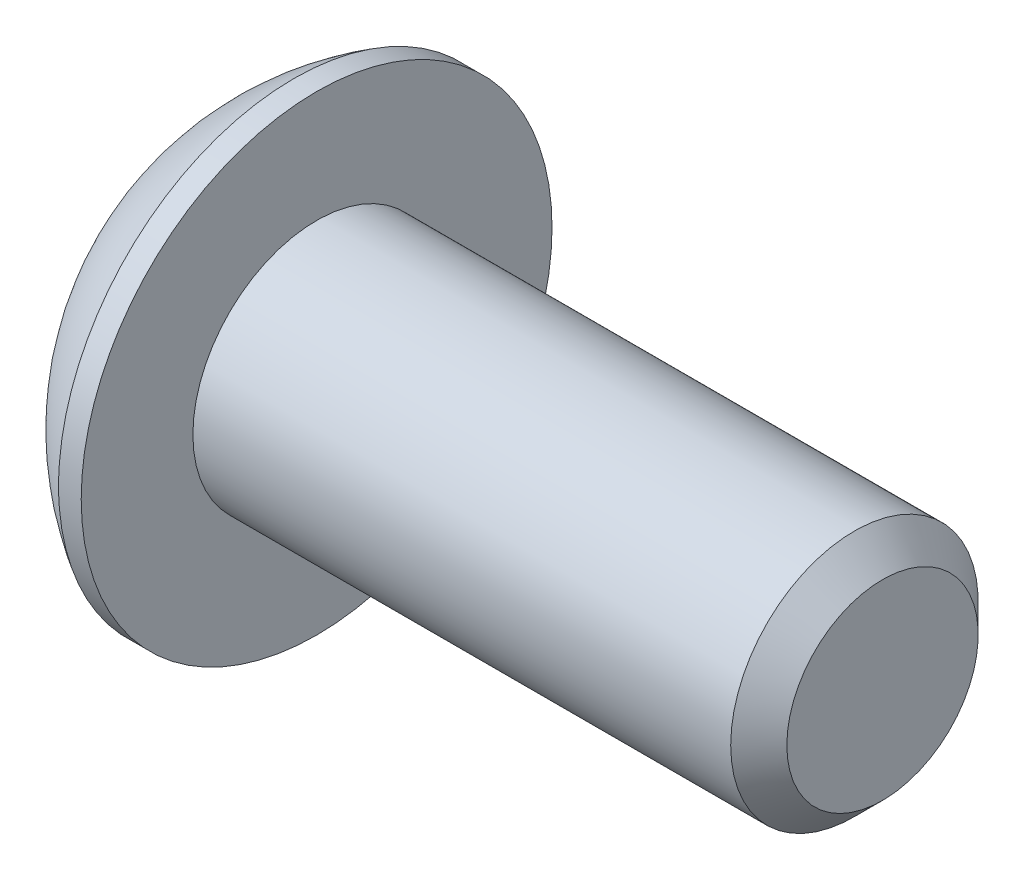
ISO-10303-21;
HEADER;
FILE_DESCRIPTION(('STEP AP214'),'2;1');
FILE_NAME('part.step','',(''),(''),'','','');
FILE_SCHEMA(('AUTOMOTIVE_DESIGN { 1 0 10303 214 1 1 1 1 }'));
ENDSEC;
DATA;
#1=APPLICATION_CONTEXT('core data for automotive mechanical design processes');
#2=APPLICATION_PROTOCOL_DEFINITION('international standard','automotive_design',2000,#1);
#3=PRODUCT_CONTEXT('',#1,'mechanical');
#4=PRODUCT('Part','Part','',(#3));
#5=PRODUCT_RELATED_PRODUCT_CATEGORY('part','',(#4));
#6=PRODUCT_DEFINITION_FORMATION('','',#4);
#7=PRODUCT_DEFINITION_CONTEXT('part definition',#1,'design');
#8=PRODUCT_DEFINITION('design','',#6,#7);
#9=PRODUCT_DEFINITION_SHAPE('','',#8);
#10=(LENGTH_UNIT() NAMED_UNIT(*) SI_UNIT(.MILLI.,.METRE.));
#11=(NAMED_UNIT(*) PLANE_ANGLE_UNIT() SI_UNIT($,.RADIAN.));
#12=(NAMED_UNIT(*) SI_UNIT($,.STERADIAN.) SOLID_ANGLE_UNIT());
#13=UNCERTAINTY_MEASURE_WITH_UNIT(LENGTH_MEASURE(1.E-05),#10,'distance_accuracy_value','');
#14=(GEOMETRIC_REPRESENTATION_CONTEXT(3) GLOBAL_UNCERTAINTY_ASSIGNED_CONTEXT((#13)) GLOBAL_UNIT_ASSIGNED_CONTEXT((#10,
#11,#12)) REPRESENTATION_CONTEXT('',''));
#15=CARTESIAN_POINT('',(0.,0.,0.));
#16=DIRECTION('',(0.,0.,1.));
#17=DIRECTION('',(1.,0.,0.));
#18=AXIS2_PLACEMENT_3D('',#15,#16,#17);
#19=CARTESIAN_POINT('',(1.32080000003043,0.,0.));
#20=DIRECTION('',(-1.,0.,0.));
#21=DIRECTION('',(0.,0.,1.));
#22=AXIS2_PLACEMENT_3D('',#19,#20,#21);
#23=CONICAL_SURFACE('',#22,1.19379999983948,1.04719755103066);
#24=CARTESIAN_POINT('',(2.01004075134392,0.,-1.70530256582424E-10));
#25=VERTEX_POINT('',#24);
#26=VERTEX_LOOP('',#25);
#27=FACE_BOUND('',#26,.T.);
#28=CARTESIAN_POINT('',(1.32079999996479,0.,0.));
#29=DIRECTION('',(-1.,0.,0.));
#30=DIRECTION('',(0.,0.,1.));
#31=AXIS2_PLACEMENT_3D('',#28,#29,#30);
#32=CIRCLE('',#31,1.19379999995317);
#33=CARTESIAN_POINT('',(1.3207999999758,1.03386112701759,-0.596899999988293));
#34=VERTEX_POINT('',#33);
#35=CARTESIAN_POINT('',(1.32079999995829,1.4946573850379E-12,-1.1937999999933));
#36=VERTEX_POINT('',#35);
#37=EDGE_CURVE('E87',#34,#36,#32,.T.);
#38=ORIENTED_EDGE('',*,*,#37,.T.);
#39=CARTESIAN_POINT('',(1.32079999996479,0.,0.));
#40=DIRECTION('',(-1.,0.,0.));
#41=DIRECTION('',(0.,0.,1.));
#42=AXIS2_PLACEMENT_3D('',#39,#40,#41);
#43=CIRCLE('',#42,1.19379999995317);
#44=CARTESIAN_POINT('',(1.3207999999758,-1.03386112701758,-0.596899999988292));
#45=VERTEX_POINT('',#44);
#46=EDGE_CURVE('E20',#36,#45,#43,.T.);
#47=ORIENTED_EDGE('',*,*,#46,.T.);
#48=CARTESIAN_POINT('',(1.32079999996479,0.,0.));
#49=DIRECTION('',(-1.,0.,0.));
#50=DIRECTION('',(0.,0.,1.));
#51=AXIS2_PLACEMENT_3D('',#48,#49,#50);
#52=CIRCLE('',#51,1.19379999995317);
#53=CARTESIAN_POINT('',(1.3207999999758,-1.03386112701759,0.596899999988292));
#54=VERTEX_POINT('',#53);
#55=EDGE_CURVE('E92',#45,#54,#52,.T.);
#56=ORIENTED_EDGE('',*,*,#55,.T.);
#57=CARTESIAN_POINT('',(1.32079999996479,0.,0.));
#58=DIRECTION('',(-1.,0.,0.));
#59=DIRECTION('',(0.,0.,1.));
#60=AXIS2_PLACEMENT_3D('',#57,#58,#59);
#61=CIRCLE('',#60,1.19379999995317);
#62=CARTESIAN_POINT('',(1.32079999995829,0.,1.1937999999933));
#63=VERTEX_POINT('',#62);
#64=EDGE_CURVE('E104',#54,#63,#61,.T.);
#65=ORIENTED_EDGE('',*,*,#64,.T.);
#66=CARTESIAN_POINT('',(1.32079999996479,0.,0.));
#67=DIRECTION('',(-1.,0.,0.));
#68=DIRECTION('',(0.,0.,1.));
#69=AXIS2_PLACEMENT_3D('',#66,#67,#68);
#70=CIRCLE('',#69,1.19379999995317);
#71=CARTESIAN_POINT('',(1.3207999999758,1.03386112701759,0.596899999988293));
#72=VERTEX_POINT('',#71);
#73=EDGE_CURVE('E112',#63,#72,#70,.T.);
#74=ORIENTED_EDGE('',*,*,#73,.T.);
#75=CARTESIAN_POINT('',(1.32079999996479,0.,0.));
#76=DIRECTION('',(-1.,0.,0.));
#77=DIRECTION('',(0.,0.,1.));
#78=AXIS2_PLACEMENT_3D('',#75,#76,#77);
#79=CIRCLE('',#78,1.19379999995317);
#80=EDGE_CURVE('E456',#72,#34,#79,.T.);
#81=ORIENTED_EDGE('',*,*,#80,.T.);
#82=EDGE_LOOP('',(#38,#47,#56,#65,#74,#81));
#83=FACE_BOUND('',#82,.T.);
#84=ADVANCED_FACE('F17',(#27,#83),#23,.F.);
#85=CARTESIAN_POINT('',(1.3208,-2.06772225407572,-1.1938));
#86=DIRECTION('',(1.,0.,0.));
#87=DIRECTION('',(0.,0.,-1.));
#88=AXIS2_PLACEMENT_3D('',#85,#86,#87);
#89=PLANE('',#88);
#90=ORIENTED_EDGE('',*,*,#46,.F.);
#91=DIRECTION('',(0.,1.,0.));
#92=VECTOR('',#91,1.);
#93=CARTESIAN_POINT('',(1.32080000000001,0.689240751358577,-1.1938));
#94=LINE('',#93,#92);
#95=CARTESIAN_POINT('',(1.32079999999561,-0.689240751358574,-1.1938));
#96=VERTEX_POINT('',#95);
#97=EDGE_CURVE('E99',#96,#36,#94,.T.);
#98=ORIENTED_EDGE('',*,*,#97,.F.);
#99=DIRECTION('',(0.,-0.5,0.866025403784439));
#100=VECTOR('',#99,1.);
#101=CARTESIAN_POINT('',(1.32079999998682,-0.689240751358574,-1.1938));
#102=LINE('',#101,#100);
#103=EDGE_CURVE('E97',#45,#96,#102,.F.);
#104=ORIENTED_EDGE('',*,*,#103,.F.);
#105=EDGE_LOOP('',(#90,#98,#104));
#106=FACE_BOUND('',#105,.T.);
#107=ADVANCED_FACE('F98',(#106),#89,.F.);
#108=CARTESIAN_POINT('',(1.3208,-2.06772225407572,-1.1938));
#109=DIRECTION('',(1.,0.,0.));
#110=DIRECTION('',(0.,0.,-1.));
#111=AXIS2_PLACEMENT_3D('',#108,#109,#110);
#112=PLANE('',#111);
#113=ORIENTED_EDGE('',*,*,#37,.F.);
#114=DIRECTION('',(0.,-0.5,-0.866025403784439));
#115=VECTOR('',#114,1.);
#116=CARTESIAN_POINT('',(1.32080000000002,1.37848150271715,0.));
#117=LINE('',#116,#115);
#118=CARTESIAN_POINT('',(1.32079999999562,0.689240751358091,-1.19380000000083));
#119=VERTEX_POINT('',#118);
#120=EDGE_CURVE('E142',#119,#34,#117,.F.);
#121=ORIENTED_EDGE('',*,*,#120,.F.);
#122=DIRECTION('',(0.,1.,0.));
#123=VECTOR('',#122,1.);
#124=CARTESIAN_POINT('',(1.32079999998682,0.689240751358577,-1.1938));
#125=LINE('',#124,#123);
#126=EDGE_CURVE('E118',#36,#119,#125,.T.);
#127=ORIENTED_EDGE('',*,*,#126,.F.);
#128=EDGE_LOOP('',(#113,#121,#127));
#129=FACE_BOUND('',#128,.T.);
#130=ADVANCED_FACE('F259',(#129),#112,.F.);
#131=CARTESIAN_POINT('',(1.3208,-2.06772225407572,-1.1938));
#132=DIRECTION('',(1.,0.,0.));
#133=DIRECTION('',(0.,0.,-1.));
#134=AXIS2_PLACEMENT_3D('',#131,#132,#133);
#135=PLANE('',#134);
#136=ORIENTED_EDGE('',*,*,#80,.F.);
#137=DIRECTION('',(0.,0.5,-0.866025403784439));
#138=VECTOR('',#137,1.);
#139=CARTESIAN_POINT('',(1.32080000000001,0.689240751358576,1.1938));
#140=LINE('',#139,#138);
#141=CARTESIAN_POINT('',(1.32079999999561,1.37848150271715,0.));
#142=VERTEX_POINT('',#141);
#143=EDGE_CURVE('E152',#142,#72,#140,.F.);
#144=ORIENTED_EDGE('',*,*,#143,.F.);
#145=DIRECTION('',(0.,-0.5,-0.866025403784439));
#146=VECTOR('',#145,1.);
#147=CARTESIAN_POINT('',(1.32079999998682,1.37848150271715,0.));
#148=LINE('',#147,#146);
#149=EDGE_CURVE('E161',#34,#142,#148,.F.);
#150=ORIENTED_EDGE('',*,*,#149,.F.);
#151=EDGE_LOOP('',(#136,#144,#150));
#152=FACE_BOUND('',#151,.T.);
#153=ADVANCED_FACE('F255',(#152),#135,.F.);
#154=CARTESIAN_POINT('',(1.3208,-2.06772225407572,-1.1938));
#155=DIRECTION('',(1.,0.,0.));
#156=DIRECTION('',(0.,0.,-1.));
#157=AXIS2_PLACEMENT_3D('',#154,#155,#156);
#158=PLANE('',#157);
#159=ORIENTED_EDGE('',*,*,#73,.F.);
#160=DIRECTION('',(0.,1.,0.));
#161=VECTOR('',#160,1.);
#162=CARTESIAN_POINT('',(1.32080000000001,-0.689240751358574,1.1938));
#163=LINE('',#162,#161);
#164=CARTESIAN_POINT('',(1.32079999999561,0.689240751358576,1.1938));
#165=VERTEX_POINT('',#164);
#166=EDGE_CURVE('E128',#165,#63,#163,.F.);
#167=ORIENTED_EDGE('',*,*,#166,.F.);
#168=DIRECTION('',(0.,0.5,-0.866025403784439));
#169=VECTOR('',#168,1.);
#170=CARTESIAN_POINT('',(1.32079999998682,0.689240751358576,1.1938));
#171=LINE('',#170,#169);
#172=EDGE_CURVE('E139',#72,#165,#171,.F.);
#173=ORIENTED_EDGE('',*,*,#172,.F.);
#174=EDGE_LOOP('',(#159,#167,#173));
#175=FACE_BOUND('',#174,.T.);
#176=ADVANCED_FACE('F252',(#175),#158,.F.);
#177=CARTESIAN_POINT('',(1.3208,-2.06772225407572,-1.1938));
#178=DIRECTION('',(1.,0.,0.));
#179=DIRECTION('',(0.,0.,-1.));
#180=AXIS2_PLACEMENT_3D('',#177,#178,#179);
#181=PLANE('',#180);
#182=ORIENTED_EDGE('',*,*,#55,.F.);
#183=DIRECTION('',(0.,-0.5,0.866025403784439));
#184=VECTOR('',#183,1.);
#185=CARTESIAN_POINT('',(1.32080000000001,-0.689240751358574,-1.1938));
#186=LINE('',#185,#184);
#187=CARTESIAN_POINT('',(1.32079999999341,-1.37848150271715,0.));
#188=VERTEX_POINT('',#187);
#189=EDGE_CURVE('E103',#188,#45,#186,.F.);
#190=ORIENTED_EDGE('',*,*,#189,.F.);
#191=DIRECTION('',(0.,0.5,0.866025403784439));
#192=VECTOR('',#191,1.);
#193=CARTESIAN_POINT('',(1.32079999998682,-1.37848150271715,0.));
#194=LINE('',#193,#192);
#195=EDGE_CURVE('E110',#54,#188,#194,.F.);
#196=ORIENTED_EDGE('',*,*,#195,.F.);
#197=EDGE_LOOP('',(#182,#190,#196));
#198=FACE_BOUND('',#197,.T.);
#199=ADVANCED_FACE('F107',(#198),#181,.F.);
#200=CARTESIAN_POINT('',(1.3208,-2.06772225407572,-1.1938));
#201=DIRECTION('',(1.,0.,0.));
#202=DIRECTION('',(0.,0.,-1.));
#203=AXIS2_PLACEMENT_3D('',#200,#201,#202);
#204=PLANE('',#203);
#205=ORIENTED_EDGE('',*,*,#64,.F.);
#206=DIRECTION('',(0.,0.5,0.866025403784439));
#207=VECTOR('',#206,1.);
#208=CARTESIAN_POINT('',(1.32080000000001,-1.37848150271715,0.));
#209=LINE('',#208,#207);
#210=CARTESIAN_POINT('',(1.32079999999561,-0.689240751358092,1.19380000000083));
#211=VERTEX_POINT('',#210);
#212=EDGE_CURVE('E196',#211,#54,#209,.F.);
#213=ORIENTED_EDGE('',*,*,#212,.F.);
#214=DIRECTION('',(0.,1.,0.));
#215=VECTOR('',#214,1.);
#216=CARTESIAN_POINT('',(1.32079999998682,-0.689240751358574,1.1938));
#217=LINE('',#216,#215);
#218=EDGE_CURVE('E136',#63,#211,#217,.F.);
#219=ORIENTED_EDGE('',*,*,#218,.F.);
#220=EDGE_LOOP('',(#205,#213,#219));
#221=FACE_BOUND('',#220,.T.);
#222=ADVANCED_FACE('F246',(#221),#204,.F.);
#223=CARTESIAN_POINT('',(1.3208,-0.689240751358574,-1.1938));
#224=DIRECTION('',(0.,0.866025403784439,0.5));
#225=DIRECTION('',(0.,-0.5,0.866025403784439));
#226=AXIS2_PLACEMENT_3D('',#223,#224,#225);
#227=PLANE('',#226);
#228=DIRECTION('',(1.,0.,0.));
#229=VECTOR('',#228,1.);
#230=CARTESIAN_POINT('',(1.3208,-1.37848150271715,0.));
#231=LINE('',#230,#229);
#232=CARTESIAN_POINT('',(0.,-1.37848150271715,0.));
#233=VERTEX_POINT('',#232);
#234=EDGE_CURVE('E117',#188,#233,#231,.F.);
#235=ORIENTED_EDGE('',*,*,#234,.F.);
#236=ORIENTED_EDGE('',*,*,#189,.T.);
#237=ORIENTED_EDGE('',*,*,#103,.T.);
#238=DIRECTION('',(1.,0.,0.));
#239=VECTOR('',#238,1.);
#240=CARTESIAN_POINT('',(1.3208,-0.689240751358574,-1.1938));
#241=LINE('',#240,#239);
#242=CARTESIAN_POINT('',(0.,-0.689240751358574,-1.1938));
#243=VERTEX_POINT('',#242);
#244=EDGE_CURVE('E120',#243,#96,#241,.T.);
#245=ORIENTED_EDGE('',*,*,#244,.F.);
#246=DIRECTION('',(0.,0.5,-0.866025403784439));
#247=VECTOR('',#246,1.);
#248=CARTESIAN_POINT('',(0.,-1.37848150271715,0.));
#249=LINE('',#248,#247);
#250=EDGE_CURVE('E183',#233,#243,#249,.T.);
#251=ORIENTED_EDGE('',*,*,#250,.F.);
#252=EDGE_LOOP('',(#235,#236,#237,#245,#251));
#253=FACE_BOUND('',#252,.T.);
#254=ADVANCED_FACE('F114',(#253),#227,.T.);
#255=CARTESIAN_POINT('',(1.3208,0.689240751358577,-1.1938));
#256=DIRECTION('',(0.,0.,1.));
#257=DIRECTION('',(1.,0.,0.));
#258=AXIS2_PLACEMENT_3D('',#255,#256,#257);
#259=PLANE('',#258);
#260=ORIENTED_EDGE('',*,*,#244,.T.);
#261=ORIENTED_EDGE('',*,*,#97,.T.);
#262=ORIENTED_EDGE('',*,*,#126,.T.);
#263=DIRECTION('',(1.,0.,0.));
#264=VECTOR('',#263,1.);
#265=CARTESIAN_POINT('',(1.3208,0.689240751358577,-1.1938));
#266=LINE('',#265,#264);
#267=CARTESIAN_POINT('',(0.,0.689240751358576,-1.1938));
#268=VERTEX_POINT('',#267);
#269=EDGE_CURVE('E163',#268,#119,#266,.T.);
#270=ORIENTED_EDGE('',*,*,#269,.F.);
#271=DIRECTION('',(0.,1.,0.));
#272=VECTOR('',#271,1.);
#273=CARTESIAN_POINT('',(0.,0.,-1.1938));
#274=LINE('',#273,#272);
#275=EDGE_CURVE('E168',#243,#268,#274,.T.);
#276=ORIENTED_EDGE('',*,*,#275,.F.);
#277=EDGE_LOOP('',(#260,#261,#262,#270,#276));
#278=FACE_BOUND('',#277,.T.);
#279=ADVANCED_FACE('F239',(#278),#259,.T.);
#280=CARTESIAN_POINT('',(1.3208,1.37848150271715,0.));
#281=DIRECTION('',(0.,-0.866025403784439,0.5));
#282=DIRECTION('',(0.,-0.5,-0.866025403784439));
#283=AXIS2_PLACEMENT_3D('',#280,#281,#282);
#284=PLANE('',#283);
#285=ORIENTED_EDGE('',*,*,#269,.T.);
#286=ORIENTED_EDGE('',*,*,#120,.T.);
#287=ORIENTED_EDGE('',*,*,#149,.T.);
#288=DIRECTION('',(1.,0.,0.));
#289=VECTOR('',#288,1.);
#290=CARTESIAN_POINT('',(1.3208,1.37848150271715,0.));
#291=LINE('',#290,#289);
#292=CARTESIAN_POINT('',(0.,1.37848150271715,0.));
#293=VERTEX_POINT('',#292);
#294=EDGE_CURVE('E141',#293,#142,#291,.T.);
#295=ORIENTED_EDGE('',*,*,#294,.F.);
#296=DIRECTION('',(0.,0.5,0.866025403784439));
#297=VECTOR('',#296,1.);
#298=CARTESIAN_POINT('',(0.,0.689240751358577,-1.1938));
#299=LINE('',#298,#297);
#300=EDGE_CURVE('E149',#268,#293,#299,.T.);
#301=ORIENTED_EDGE('',*,*,#300,.F.);
#302=EDGE_LOOP('',(#285,#286,#287,#295,#301));
#303=FACE_BOUND('',#302,.T.);
#304=ADVANCED_FACE('F235',(#303),#284,.T.);
#305=CARTESIAN_POINT('',(1.3208,0.689240751358576,1.1938));
#306=DIRECTION('',(0.,-0.866025403784439,-0.5));
#307=DIRECTION('',(0.,0.5,-0.866025403784439));
#308=AXIS2_PLACEMENT_3D('',#305,#306,#307);
#309=PLANE('',#308);
#310=ORIENTED_EDGE('',*,*,#294,.T.);
#311=ORIENTED_EDGE('',*,*,#143,.T.);
#312=ORIENTED_EDGE('',*,*,#172,.T.);
#313=DIRECTION('',(1.,0.,0.));
#314=VECTOR('',#313,1.);
#315=CARTESIAN_POINT('',(1.3208,0.689240751358576,1.1938));
#316=LINE('',#315,#314);
#317=CARTESIAN_POINT('',(0.,0.689240751358577,1.1938));
#318=VERTEX_POINT('',#317);
#319=EDGE_CURVE('E131',#318,#165,#316,.T.);
#320=ORIENTED_EDGE('',*,*,#319,.F.);
#321=DIRECTION('',(0.,-0.5,0.866025403784439));
#322=VECTOR('',#321,1.);
#323=CARTESIAN_POINT('',(0.,1.37848150271715,0.));
#324=LINE('',#323,#322);
#325=EDGE_CURVE('E145',#293,#318,#324,.T.);
#326=ORIENTED_EDGE('',*,*,#325,.F.);
#327=EDGE_LOOP('',(#310,#311,#312,#320,#326));
#328=FACE_BOUND('',#327,.T.);
#329=ADVANCED_FACE('F232',(#328),#309,.T.);
#330=CARTESIAN_POINT('',(1.3208,-0.689240751358574,1.1938));
#331=DIRECTION('',(0.,0.,-1.));
#332=DIRECTION('',(0.,1.,0.));
#333=AXIS2_PLACEMENT_3D('',#330,#331,#332);
#334=PLANE('',#333);
#335=ORIENTED_EDGE('',*,*,#319,.T.);
#336=ORIENTED_EDGE('',*,*,#166,.T.);
#337=ORIENTED_EDGE('',*,*,#218,.T.);
#338=DIRECTION('',(1.,0.,0.));
#339=VECTOR('',#338,1.);
#340=CARTESIAN_POINT('',(1.3208,-0.689240751358574,1.1938));
#341=LINE('',#340,#339);
#342=CARTESIAN_POINT('',(0.,-0.689240751358574,1.1938));
#343=VERTEX_POINT('',#342);
#344=EDGE_CURVE('E35',#343,#211,#341,.T.);
#345=ORIENTED_EDGE('',*,*,#344,.F.);
#346=DIRECTION('',(0.,1.,0.));
#347=VECTOR('',#346,1.);
#348=CARTESIAN_POINT('',(0.,0.,1.1938));
#349=LINE('',#348,#347);
#350=EDGE_CURVE('E148',#318,#343,#349,.F.);
#351=ORIENTED_EDGE('',*,*,#350,.F.);
#352=EDGE_LOOP('',(#335,#336,#337,#345,#351));
#353=FACE_BOUND('',#352,.T.);
#354=ADVANCED_FACE('F228',(#353),#334,.T.);
#355=CARTESIAN_POINT('',(1.3208,-1.37848150271715,0.));
#356=DIRECTION('',(0.,0.866025403784439,-0.5));
#357=DIRECTION('',(0.,0.5,0.866025403784439));
#358=AXIS2_PLACEMENT_3D('',#355,#356,#357);
#359=PLANE('',#358);
#360=ORIENTED_EDGE('',*,*,#344,.T.);
#361=ORIENTED_EDGE('',*,*,#212,.T.);
#362=ORIENTED_EDGE('',*,*,#195,.T.);
#363=ORIENTED_EDGE('',*,*,#234,.T.);
#364=DIRECTION('',(0.,-0.5,-0.866025403784439));
#365=VECTOR('',#364,1.);
#366=CARTESIAN_POINT('',(0.,-0.689240751358574,1.1938));
#367=LINE('',#366,#365);
#368=EDGE_CURVE('E215',#343,#233,#367,.T.);
#369=ORIENTED_EDGE('',*,*,#368,.F.);
#370=EDGE_LOOP('',(#360,#361,#362,#363,#369));
#371=FACE_BOUND('',#370,.T.);
#372=ADVANCED_FACE('F224',(#371),#359,.T.);
#373=CARTESIAN_POINT('',(0.,0.,0.));
#374=DIRECTION('',(-1.,0.,0.));
#375=DIRECTION('',(0.,0.,1.));
#376=AXIS2_PLACEMENT_3D('',#373,#374,#375);
#377=PLANE('',#376);
#378=ORIENTED_EDGE('',*,*,#350,.T.);
#379=ORIENTED_EDGE('',*,*,#368,.T.);
#380=ORIENTED_EDGE('',*,*,#250,.T.);
#381=ORIENTED_EDGE('',*,*,#275,.T.);
#382=ORIENTED_EDGE('',*,*,#300,.T.);
#383=ORIENTED_EDGE('',*,*,#325,.T.);
#384=EDGE_LOOP('',(#378,#379,#380,#381,#382,#383));
#385=FACE_BOUND('',#384,.T.);
#386=CARTESIAN_POINT('',(0.,0.,-1.9812));
#387=CARTESIAN_POINT('',(0.,0.0556258831179939,-1.9811996664299));
#388=CARTESIAN_POINT('',(0.,0.111261989398713,-1.97885520380444));
#389=CARTESIAN_POINT('',(0.,0.22214971983063,-1.96949260169536));
#390=CARTESIAN_POINT('',(0.,0.277401225603079,-1.96247308239593));
#391=CARTESIAN_POINT('',(0.,0.387209508140096,-1.94379192841042));
#392=CARTESIAN_POINT('',(0.,0.441765039546866,-1.93212292489554));
#393=CARTESIAN_POINT('',(0.,0.54972944934789,-1.90422331175264));
#394=CARTESIAN_POINT('',(0.,0.603137359209011,-1.88798900035182));
#395=CARTESIAN_POINT('',(0.,0.760839131321933,-1.83266214476236));
#396=CARTESIAN_POINT('',(0.,0.862876433576543,-1.7869002364878));
#397=CARTESIAN_POINT('',(0.,1.05780719540975,-1.67887358150614));
#398=CARTESIAN_POINT('',(0.,1.15070030720794,-1.61660820745611));
#399=CARTESIAN_POINT('',(0.,1.28116890915741,-1.51224157140783));
#400=CARTESIAN_POINT('',(0.,1.3232045112712,-1.4755970394341));
#401=CARTESIAN_POINT('',(0.,1.4040028869583,-1.39893832619639));
#402=CARTESIAN_POINT('',(0.,1.44276877695555,-1.3589274278461));
#403=CARTESIAN_POINT('',(0.,1.55382272417958,-1.23416504602091));
#404=CARTESIAN_POINT('',(0.,1.62089527952161,-1.14466125559776));
#405=CARTESIAN_POINT('',(0.,1.73902218081221,-0.955712144177528));
#406=CARTESIAN_POINT('',(0.,1.79007713076041,-0.856267198232881));
#407=CARTESIAN_POINT('',(0.,1.87477637530978,-0.650206345910103));
#408=CARTESIAN_POINT('',(0.,1.90842085586288,-0.543590516134101));
#409=CARTESIAN_POINT('',(0.,1.95733039300669,-0.326226155291239));
#410=CARTESIAN_POINT('',(0.,1.97259535144296,-0.215477602157138));
#411=CARTESIAN_POINT('',(0.,1.98431697865418,0.00701040587624637));
#412=CARTESIAN_POINT('',(0.,1.98077364742913,0.11874986077553));
#413=CARTESIAN_POINT('',(0.,1.9549748562381,0.340050178356241));
#414=CARTESIAN_POINT('',(0.,1.93271949620196,0.449611052668974));
#415=CARTESIAN_POINT('',(0.,1.87014138774503,0.663431110729876));
#416=CARTESIAN_POINT('',(0.,1.8298184463526,0.767690237839243));
#417=CARTESIAN_POINT('',(0.,1.73219968377079,0.968005760720023));
#418=CARTESIAN_POINT('',(0.,1.67490322251608,1.06406184698171));
#419=CARTESIAN_POINT('',(0.,1.57757371205829,1.19980276751336));
#420=CARTESIAN_POINT('',(0.,1.54322665019419,1.24366557129264));
#421=CARTESIAN_POINT('',(0.,1.4709306317422,1.32838995706751));
#422=CARTESIAN_POINT('',(0.,1.43297823102402,1.36924860178767));
#423=CARTESIAN_POINT('',(1.12614791033183E-13,1.31419842051137,1.48674671849285));
#424=CARTESIAN_POINT('',(0.,1.22836221289257,1.55842832343277));
#425=CARTESIAN_POINT('',(0.,1.04586168272432,1.68633968564789));
#426=CARTESIAN_POINT('',(1.48935068169123E-13,0.949197771949297,1.74257003024941));
#427=CARTESIAN_POINT('',(0.,0.798182600298149,1.81416142504053));
#428=CARTESIAN_POINT('',(0.,0.746776203847196,1.83591780585903));
#429=CARTESIAN_POINT('',(0.,0.642341081687984,1.87500754181109));
#430=CARTESIAN_POINT('',(0.,0.589313708122197,1.89234447645425));
#431=CARTESIAN_POINT('',(0.,0.482076273027727,1.9224605343357));
#432=CARTESIAN_POINT('',(0.,0.42786822425682,1.93524685475124));
#433=CARTESIAN_POINT('',(0.,0.318578151843939,1.95620937250513));
#434=CARTESIAN_POINT('',(1.62487665845332E-13,0.263496390912239,1.9643869295819));
#435=CARTESIAN_POINT('',(1.09866344886805E-13,0.173607715038036,1.97388528284681));
#436=CARTESIAN_POINT('',(0.,0.138944718024568,1.97662743364436));
#437=CARTESIAN_POINT('',(0.,0.0695224782564756,1.98028489645278));
#438=CARTESIAN_POINT('',(0.,0.0347632355018517,1.98120020846365));
#439=CARTESIAN_POINT('',(0.,-0.0556258831179868,1.98119966642994));
#440=CARTESIAN_POINT('',(0.,-0.1112619893987,1.97885520380445));
#441=CARTESIAN_POINT('',(0.,-0.222149719830617,1.96949260169536));
#442=CARTESIAN_POINT('',(0.,-0.277401225603069,1.96247308239594));
#443=CARTESIAN_POINT('',(0.,-0.387209508140058,1.94379192841042));
#444=CARTESIAN_POINT('',(0.,-0.441765039546798,1.93212292489549));
#445=CARTESIAN_POINT('',(0.,-0.549729449347829,1.90422331175272));
#446=CARTESIAN_POINT('',(1.15174737985554E-13,-0.603137359208986,1.88798900035208));
#447=CARTESIAN_POINT('',(1.9106754608912E-13,-0.760839131321914,1.8326621447628));
#448=CARTESIAN_POINT('',(0.,-0.862876433576361,1.7869002364879));
#449=CARTESIAN_POINT('',(0.,-1.05780719540959,1.67887358150622));
#450=CARTESIAN_POINT('',(1.65211094330821E-13,-1.15070030720797,1.61660820745651));
#451=CARTESIAN_POINT('',(1.04718177002708E-13,-1.28116890915736,1.51224157140816));
#452=CARTESIAN_POINT('',(0.,-1.32320451127105,1.47559703943432));
#453=CARTESIAN_POINT('',(0.,-1.40400288695809,1.39893832619651));
#454=CARTESIAN_POINT('',(0.,-1.44276877695536,1.35892742784624));
#455=CARTESIAN_POINT('',(0.,-1.5538227241795,1.23416504602113));
#456=CARTESIAN_POINT('',(1.16640667501523E-13,-1.62089527952169,1.14466125559806));
#457=CARTESIAN_POINT('',(0.,-1.73902218081228,0.955712144177823));
#458=CARTESIAN_POINT('',(0.,-1.79007713076032,0.856267198233086));
#459=CARTESIAN_POINT('',(0.,-1.87477637530972,0.65020634591027));
#460=CARTESIAN_POINT('',(0.,-1.90842085586301,0.543590516134321));
#461=CARTESIAN_POINT('',(1.04616735760756E-13,-1.95733039300687,0.326226155291472));
#462=CARTESIAN_POINT('',(0.,-1.972595351443,0.215477602157332));
#463=CARTESIAN_POINT('',(0.,-1.98431697865412,-0.00701040587609105));
#464=CARTESIAN_POINT('',(0.,-1.98077364742911,-0.118749860775374));
#465=CARTESIAN_POINT('',(0.,-1.95497485623815,-0.340050178356116));
#466=CARTESIAN_POINT('',(0.,-1.93271949620203,-0.449611052668881));
#467=CARTESIAN_POINT('',(0.,-1.87014138774502,-0.663431110729782));
#468=CARTESIAN_POINT('',(0.,-1.82981844635247,-0.767690237839115));
#469=CARTESIAN_POINT('',(0.,-1.73219968377065,-0.968005760719907));
#470=CARTESIAN_POINT('',(0.,-1.67490322251605,-1.06406184698164));
#471=CARTESIAN_POINT('',(0.,-1.57757371205834,-1.19980276751334));
#472=CARTESIAN_POINT('',(0.,-1.54322665019425,-1.24366557129263));
#473=CARTESIAN_POINT('',(0.,-1.4709306317422,-1.32838995706743));
#474=CARTESIAN_POINT('',(0.,-1.43297823102395,-1.36924860178752));
#475=CARTESIAN_POINT('',(0.,-1.31419842051124,-1.48674671849265));
#476=CARTESIAN_POINT('',(0.,-1.2283622128926,-1.55842832343277));
#477=CARTESIAN_POINT('',(0.,-1.04586168272438,-1.68633968564784));
#478=CARTESIAN_POINT('',(0.,-0.949197771949206,-1.7425700302491));
#479=CARTESIAN_POINT('',(0.,-0.798182600298094,-1.81416142504036));
#480=CARTESIAN_POINT('',(0.,-0.746776203847196,-1.83591780585899));
#481=CARTESIAN_POINT('',(0.,-0.642341081688034,-1.87500754181112));
#482=CARTESIAN_POINT('',(0.,-0.589313708122242,-1.89234447645423));
#483=CARTESIAN_POINT('',(0.,-0.482076273027781,-1.9224605343357));
#484=CARTESIAN_POINT('',(0.,-0.42786822425689,-1.93524685475132));
#485=CARTESIAN_POINT('',(0.,-0.31857815184398,-1.95620937250504));
#486=CARTESIAN_POINT('',(0.,-0.263496390912235,-1.96438692958155));
#487=CARTESIAN_POINT('',(0.,-0.17360771503802,-1.97388528284658));
#488=CARTESIAN_POINT('',(0.,-0.138944718024565,-1.97662743364429));
#489=CARTESIAN_POINT('',(0.,-0.0695224782564821,-1.98028489645284));
#490=CARTESIAN_POINT('',(0.,-0.0347632355018552,-1.98120020846367));
#491=CARTESIAN_POINT('',(0.,0.,-1.9812));
#492=B_SPLINE_CURVE_WITH_KNOTS('',3,(#386,#387,#388,#389,#390,#391,#392,#393,#394,#395,#396,
#397,#398,#399,#400,#401,#402,#403,#404,#405,#406,#407,#408,#409,#410,#411,#412,#413,#414,#415,
#416,#417,#418,#419,#420,#421,#422,#423,#424,#425,#426,#427,#428,#429,#430,#431,#432,#433,#434,
#435,#436,#437,#438,#439,#440,#441,#442,#443,#444,#445,#446,#447,#448,#449,#450,#451,#452,#453,
#454,#455,#456,#457,#458,#459,#460,#461,#462,#463,#464,#465,#466,#467,#468,#469,#470,#471,#472,
#473,#474,#475,#476,#477,#478,#479,#480,#481,#482,#483,#484,#485,#486,#487,#488,#489,#490,#491),
.UNSPECIFIED.,.T.,.F.,(4,2,2,2,2,2,2,2,2,2,2,2,2,2,2,2,2,2,2,2,2,2,2,2,2,2,2,2,2,2,2,2,2,2,2,2,
2,2,2,2,2,2,2,2,2,2,2,2,2,2,2,2,4),(0.,0.166845646007973,0.333740557374508,0.500901034368148,
0.668197445943089,1.00199278686382,1.3358008181001,1.50292354033088,1.66988513108616,
2.00370118900166,2.33750465770578,2.67130456115946,3.00510624723839,3.33890793331733,
3.67270783677097,4.00651130547504,4.34032736339057,4.50728895414585,4.67441167637663,
5.00821970761293,5.34201504853366,5.50931146010859,5.67647193710226,5.8433668484688,
6.01021249447674,6.11448220058335,6.21875190668997,6.38559755269793,6.55249246406446,
6.71965294105805,6.88694935263293,7.22074469355364,7.55455272478989,7.72167544702067,
7.88863703777598,8.22245309569151,8.55625656439566,8.89005646784937,9.22385815392833,
9.5576598400073,9.89145974346099,10.2252632121651,10.5590792700806,10.7260408608359,
10.8931635830667,11.2269716143029,11.5607669552237,11.7280633667986,11.8952238437922,
12.0621187551588,12.2289644011667,12.3332341072734,12.43750381338),.UNSPECIFIED.);
#493=CARTESIAN_POINT('',(0.,0.,-1.9812));
#494=VERTEX_POINT('',#493);
#495=EDGE_CURVE('E208',#494,#494,#492,.T.);
#496=ORIENTED_EDGE('',*,*,#495,.F.);
#497=EDGE_LOOP('',(#496));
#498=FACE_BOUND('',#497,.T.);
#499=ADVANCED_FACE('F220',(#385,#498),#377,.T.);
#500=CARTESIAN_POINT('',(4.13385,0.,0.));
#501=DIRECTION('',(-0.489667403954941,0.,-0.87190930348519));
#502=DIRECTION('',(0.,-1.,0.));
#503=AXIS2_PLACEMENT_3D('',#500,#501,#502);
#504=SPHERICAL_SURFACE('',#503,4.58408870578439);
#505=CARTESIAN_POINT('',(1.8288,0.,0.));
#506=DIRECTION('',(-1.,0.,0.));
#507=DIRECTION('',(0.,0.,1.));
#508=AXIS2_PLACEMENT_3D('',#505,#506,#507);
#509=CIRCLE('',#508,3.9624);
#510=CARTESIAN_POINT('',(1.8288,0.,3.9624));
#511=VERTEX_POINT('',#510);
#512=EDGE_CURVE('E205',#511,#511,#509,.F.);
#513=ORIENTED_EDGE('',*,*,#512,.F.);
#514=EDGE_LOOP('',(#513));
#515=FACE_BOUND('',#514,.T.);
#516=ORIENTED_EDGE('',*,*,#495,.T.);
#517=EDGE_LOOP('',(#516));
#518=FACE_BOUND('',#517,.T.);
#519=ADVANCED_FACE('F216',(#515,#518),#504,.T.);
#520=CARTESIAN_POINT('',(11.7348,0.,0.));
#521=DIRECTION('',(-1.,0.,0.));
#522=DIRECTION('',(0.,0.,1.));
#523=AXIS2_PLACEMENT_3D('',#520,#521,#522);
#524=PLANE('',#523);
#525=CARTESIAN_POINT('',(11.7347999999993,0.,0.));
#526=DIRECTION('',(-1.,0.,0.));
#527=DIRECTION('',(0.,0.,1.));
#528=AXIS2_PLACEMENT_3D('',#525,#526,#527);
#529=CIRCLE('',#528,1.61035999997239);
#530=CARTESIAN_POINT('',(11.7347999999993,0.,1.61035999997239));
#531=VERTEX_POINT('',#530);
#532=EDGE_CURVE('E202',#531,#531,#529,.T.);
#533=ORIENTED_EDGE('',*,*,#532,.F.);
#534=EDGE_LOOP('',(#533));
#535=FACE_BOUND('',#534,.T.);
#536=ADVANCED_FACE('F287',(#535),#524,.F.);
#537=CARTESIAN_POINT('',(0.,0.,0.));
#538=DIRECTION('',(-1.,0.,0.));
#539=DIRECTION('',(0.,0.,1.));
#540=AXIS2_PLACEMENT_3D('',#537,#538,#539);
#541=CYLINDRICAL_SURFACE('',#540,3.9624);
#542=ORIENTED_EDGE('',*,*,#512,.T.);
#543=EDGE_LOOP('',(#542));
#544=FACE_BOUND('',#543,.T.);
#545=CARTESIAN_POINT('',(2.2098,0.,0.));
#546=DIRECTION('',(-1.,0.,0.));
#547=DIRECTION('',(0.,0.,1.));
#548=AXIS2_PLACEMENT_3D('',#545,#546,#547);
#549=CIRCLE('',#548,3.9624);
#550=CARTESIAN_POINT('',(2.2098,0.,3.9624));
#551=VERTEX_POINT('',#550);
#552=EDGE_CURVE('E199',#551,#551,#549,.T.);
#553=ORIENTED_EDGE('',*,*,#552,.T.);
#554=EDGE_LOOP('',(#553));
#555=FACE_BOUND('',#554,.T.);
#556=ADVANCED_FACE('F284',(#544,#555),#541,.T.);
#557=CARTESIAN_POINT('',(11.2623600001029,0.,0.));
#558=DIRECTION('',(-1.,0.,0.));
#559=DIRECTION('',(0.,0.,1.));
#560=AXIS2_PLACEMENT_3D('',#557,#558,#559);
#561=CONICAL_SURFACE('',#560,2.08279999986871,0.785398163397448);
#562=CARTESIAN_POINT('',(11.26236,0.,0.));
#563=DIRECTION('',(-1.,0.,0.));
#564=DIRECTION('',(0.,0.,1.));
#565=AXIS2_PLACEMENT_3D('',#562,#563,#564);
#566=CIRCLE('',#565,2.0828);
#567=CARTESIAN_POINT('',(11.26236,0.,2.0828));
#568=VERTEX_POINT('',#567);
#569=EDGE_CURVE('E26',#568,#568,#566,.T.);
#570=ORIENTED_EDGE('',*,*,#569,.F.);
#571=EDGE_LOOP('',(#570));
#572=FACE_BOUND('',#571,.T.);
#573=ORIENTED_EDGE('',*,*,#532,.T.);
#574=EDGE_LOOP('',(#573));
#575=FACE_BOUND('',#574,.T.);
#576=ADVANCED_FACE('F277',(#572,#575),#561,.T.);
#577=CARTESIAN_POINT('',(2.2098,2.0828,0.));
#578=DIRECTION('',(-1.,0.,0.));
#579=DIRECTION('',(0.,0.,1.));
#580=AXIS2_PLACEMENT_3D('',#577,#578,#579);
#581=PLANE('',#580);
#582=CARTESIAN_POINT('',(2.2098,0.,0.));
#583=DIRECTION('',(-1.,0.,0.));
#584=DIRECTION('',(0.,0.,1.));
#585=AXIS2_PLACEMENT_3D('',#582,#583,#584);
#586=CIRCLE('',#585,2.0828);
#587=CARTESIAN_POINT('',(2.2098,0.,2.0828));
#588=VERTEX_POINT('',#587);
#589=EDGE_CURVE('E11',#588,#588,#586,.F.);
#590=ORIENTED_EDGE('',*,*,#589,.F.);
#591=EDGE_LOOP('',(#590));
#592=FACE_BOUND('',#591,.T.);
#593=ORIENTED_EDGE('',*,*,#552,.F.);
#594=EDGE_LOOP('',(#593));
#595=FACE_BOUND('',#594,.T.);
#596=ADVANCED_FACE('F271',(#592,#595),#581,.F.);
#597=CARTESIAN_POINT('',(0.,0.,0.));
#598=DIRECTION('',(-1.,0.,0.));
#599=DIRECTION('',(0.,0.,1.));
#600=AXIS2_PLACEMENT_3D('',#597,#598,#599);
#601=CYLINDRICAL_SURFACE('',#600,2.0828);
#602=ORIENTED_EDGE('',*,*,#589,.T.);
#603=EDGE_LOOP('',(#602));
#604=FACE_BOUND('',#603,.T.);
#605=ORIENTED_EDGE('',*,*,#569,.T.);
#606=EDGE_LOOP('',(#605));
#607=FACE_BOUND('',#606,.T.);
#608=ADVANCED_FACE('F269',(#604,#607),#601,.T.);
#609=CLOSED_SHELL('',(#84,#107,#130,#153,#176,#199,#222,#254,#279,#304,#329,#354,#372,#499,#519,
#536,#556,#576,#596,#608));
#610=MANIFOLD_SOLID_BREP('B1',#609);
#611=ADVANCED_BREP_SHAPE_REPRESENTATION('',(#18,#610),#14);
#612=SHAPE_DEFINITION_REPRESENTATION(#9,#611);
ENDSEC;
END-ISO-10303-21;
